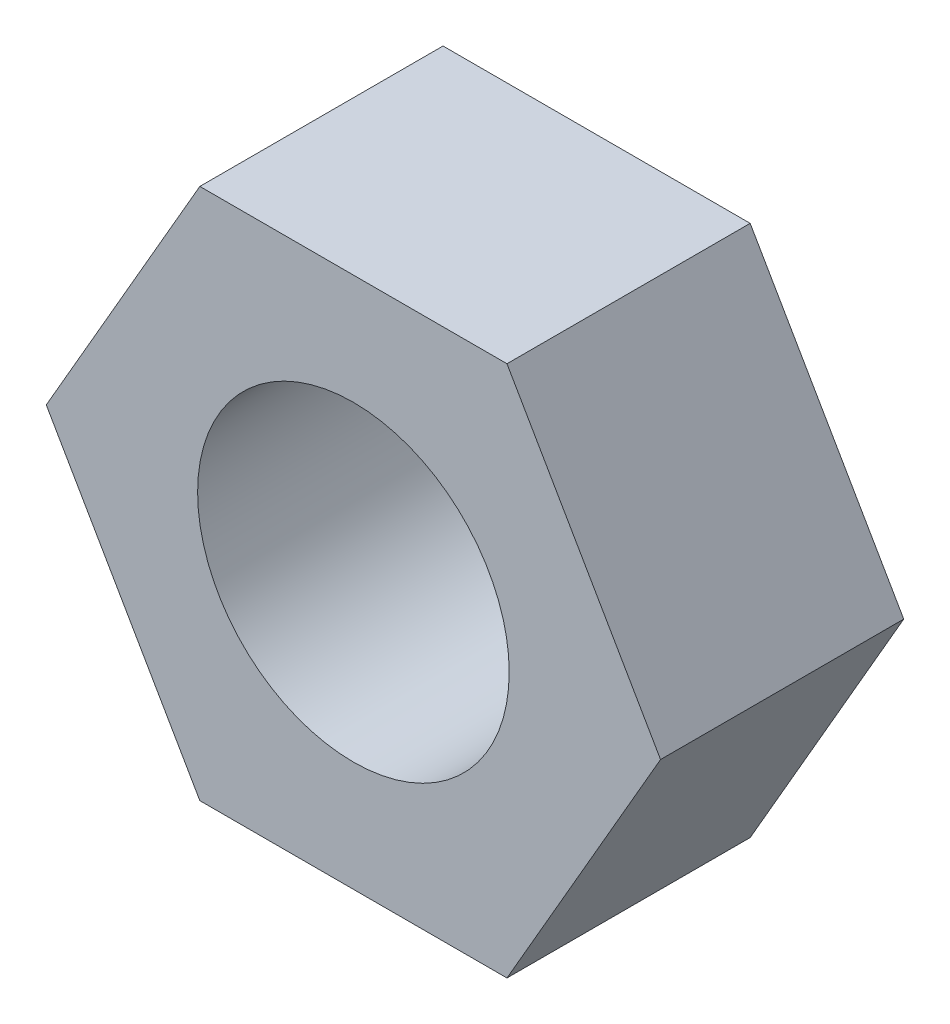
ISO-10303-21;
HEADER;
FILE_DESCRIPTION(('STEP AP214'),'2;1');
FILE_NAME('part.step','',(''),(''),'','','');
FILE_SCHEMA(('AUTOMOTIVE_DESIGN { 1 0 10303 214 1 1 1 1 }'));
ENDSEC;
DATA;
#1=APPLICATION_CONTEXT('core data for automotive mechanical design processes');
#2=APPLICATION_PROTOCOL_DEFINITION('international standard','automotive_design',2000,#1);
#3=PRODUCT_CONTEXT('',#1,'mechanical');
#4=PRODUCT('Part','Part','',(#3));
#5=PRODUCT_RELATED_PRODUCT_CATEGORY('part','',(#4));
#6=PRODUCT_DEFINITION_FORMATION('','',#4);
#7=PRODUCT_DEFINITION_CONTEXT('part definition',#1,'design');
#8=PRODUCT_DEFINITION('design','',#6,#7);
#9=PRODUCT_DEFINITION_SHAPE('','',#8);
#10=(LENGTH_UNIT() NAMED_UNIT(*) SI_UNIT(.MILLI.,.METRE.));
#11=(NAMED_UNIT(*) PLANE_ANGLE_UNIT() SI_UNIT($,.RADIAN.));
#12=(NAMED_UNIT(*) SI_UNIT($,.STERADIAN.) SOLID_ANGLE_UNIT());
#13=UNCERTAINTY_MEASURE_WITH_UNIT(LENGTH_MEASURE(1.E-05),#10,'distance_accuracy_value','');
#14=(GEOMETRIC_REPRESENTATION_CONTEXT(3) GLOBAL_UNCERTAINTY_ASSIGNED_CONTEXT((#13)) GLOBAL_UNIT_ASSIGNED_CONTEXT((#10,
#11,#12)) REPRESENTATION_CONTEXT('',''));
#15=CARTESIAN_POINT('',(0.,0.,0.));
#16=DIRECTION('',(0.,0.,1.));
#17=DIRECTION('',(1.,0.,0.));
#18=AXIS2_PLACEMENT_3D('',#15,#16,#17);
#19=CARTESIAN_POINT('',(2.02072594216373,-3.49999999999998,3.2));
#20=DIRECTION('',(-0.866025403784442,0.499999999999995,0.));
#21=DIRECTION('',(-0.499999999999995,-0.866025403784442,0.));
#22=AXIS2_PLACEMENT_3D('',#19,#20,#21);
#23=PLANE('',#22);
#24=DIRECTION('',(0.499999999999995,0.866025403784442,0.));
#25=VECTOR('',#24,1.);
#26=CARTESIAN_POINT('',(2.02072594216373,-3.49999999999998,0.));
#27=LINE('',#26,#25);
#28=CARTESIAN_POINT('',(2.02072594216373,-3.49999999999998,0.));
#29=VERTEX_POINT('',#28);
#30=CARTESIAN_POINT('',(4.04145188432738,0.,0.));
#31=VERTEX_POINT('',#30);
#32=EDGE_CURVE('E117',#29,#31,#27,.T.);
#33=ORIENTED_EDGE('',*,*,#32,.T.);
#34=DIRECTION('',(0.,0.,-1.));
#35=VECTOR('',#34,1.);
#36=CARTESIAN_POINT('',(4.04145188432738,0.,3.2));
#37=LINE('',#36,#35);
#38=CARTESIAN_POINT('',(4.04145188432738,0.,3.2));
#39=VERTEX_POINT('',#38);
#40=EDGE_CURVE('E11',#39,#31,#37,.T.);
#41=ORIENTED_EDGE('',*,*,#40,.F.);
#42=DIRECTION('',(0.499999999999995,0.866025403784442,0.));
#43=VECTOR('',#42,1.);
#44=CARTESIAN_POINT('',(2.02072594216373,-3.49999999999998,3.2));
#45=LINE('',#44,#43);
#46=CARTESIAN_POINT('',(2.02072594216373,-3.49999999999998,3.2));
#47=VERTEX_POINT('',#46);
#48=EDGE_CURVE('E128',#47,#39,#45,.T.);
#49=ORIENTED_EDGE('',*,*,#48,.F.);
#50=DIRECTION('',(0.,0.,-1.));
#51=VECTOR('',#50,1.);
#52=CARTESIAN_POINT('',(2.02072594216373,-3.49999999999998,3.2));
#53=LINE('',#52,#51);
#54=EDGE_CURVE('E113',#47,#29,#53,.T.);
#55=ORIENTED_EDGE('',*,*,#54,.T.);
#56=EDGE_LOOP('',(#33,#41,#49,#55));
#57=FACE_BOUND('',#56,.T.);
#58=ADVANCED_FACE('F33',(#57),#23,.F.);
#59=CARTESIAN_POINT('',(4.04145188432738,0.,3.2));
#60=DIRECTION('',(-0.866025403784438,-0.500000000000001,0.));
#61=DIRECTION('',(0.500000000000001,-0.866025403784438,0.));
#62=AXIS2_PLACEMENT_3D('',#59,#60,#61);
#63=PLANE('',#62);
#64=DIRECTION('',(-0.500000000000001,0.866025403784438,0.));
#65=VECTOR('',#64,1.);
#66=CARTESIAN_POINT('',(4.04145188432738,0.,0.));
#67=LINE('',#66,#65);
#68=CARTESIAN_POINT('',(2.02072594216368,3.50000000000001,0.));
#69=VERTEX_POINT('',#68);
#70=EDGE_CURVE('E120',#31,#69,#67,.T.);
#71=ORIENTED_EDGE('',*,*,#70,.T.);
#72=DIRECTION('',(0.,0.,-1.));
#73=VECTOR('',#72,1.);
#74=CARTESIAN_POINT('',(2.02072594216368,3.50000000000001,3.2));
#75=LINE('',#74,#73);
#76=CARTESIAN_POINT('',(2.02072594216368,3.50000000000001,3.2));
#77=VERTEX_POINT('',#76);
#78=EDGE_CURVE('E41',#77,#69,#75,.T.);
#79=ORIENTED_EDGE('',*,*,#78,.F.);
#80=DIRECTION('',(-0.500000000000001,0.866025403784438,0.));
#81=VECTOR('',#80,1.);
#82=CARTESIAN_POINT('',(4.04145188432738,0.,3.2));
#83=LINE('',#82,#81);
#84=EDGE_CURVE('E86',#39,#77,#83,.T.);
#85=ORIENTED_EDGE('',*,*,#84,.F.);
#86=ORIENTED_EDGE('',*,*,#40,.T.);
#87=EDGE_LOOP('',(#71,#79,#85,#86));
#88=FACE_BOUND('',#87,.T.);
#89=ADVANCED_FACE('F153',(#88),#63,.F.);
#90=CARTESIAN_POINT('',(2.02072594216368,3.50000000000001,3.2));
#91=DIRECTION('',(0.,-1.,0.));
#92=DIRECTION('',(1.,0.,0.));
#93=AXIS2_PLACEMENT_3D('',#90,#91,#92);
#94=PLANE('',#93);
#95=DIRECTION('',(-1.,0.,0.));
#96=VECTOR('',#95,1.);
#97=CARTESIAN_POINT('',(2.02072594216368,3.50000000000001,0.));
#98=LINE('',#97,#96);
#99=CARTESIAN_POINT('',(-2.02072594216371,3.49999999999999,0.));
#100=VERTEX_POINT('',#99);
#101=EDGE_CURVE('E123',#69,#100,#98,.T.);
#102=ORIENTED_EDGE('',*,*,#101,.T.);
#103=DIRECTION('',(0.,0.,-1.));
#104=VECTOR('',#103,1.);
#105=CARTESIAN_POINT('',(-2.02072594216371,3.49999999999999,3.2));
#106=LINE('',#105,#104);
#107=CARTESIAN_POINT('',(-2.02072594216371,3.49999999999999,3.2));
#108=VERTEX_POINT('',#107);
#109=EDGE_CURVE('E108',#108,#100,#106,.T.);
#110=ORIENTED_EDGE('',*,*,#109,.F.);
#111=DIRECTION('',(-1.,0.,0.));
#112=VECTOR('',#111,1.);
#113=CARTESIAN_POINT('',(2.02072594216368,3.50000000000001,3.2));
#114=LINE('',#113,#112);
#115=EDGE_CURVE('E99',#77,#108,#114,.T.);
#116=ORIENTED_EDGE('',*,*,#115,.F.);
#117=ORIENTED_EDGE('',*,*,#78,.T.);
#118=EDGE_LOOP('',(#102,#110,#116,#117));
#119=FACE_BOUND('',#118,.T.);
#120=ADVANCED_FACE('F134',(#119),#94,.F.);
#121=CARTESIAN_POINT('',(-2.02072594216371,3.49999999999999,3.2));
#122=DIRECTION('',(0.866025403784442,-0.499999999999995,0.));
#123=DIRECTION('',(0.499999999999995,0.866025403784442,0.));
#124=AXIS2_PLACEMENT_3D('',#121,#122,#123);
#125=PLANE('',#124);
#126=DIRECTION('',(-0.499999999999995,-0.866025403784442,0.));
#127=VECTOR('',#126,1.);
#128=CARTESIAN_POINT('',(-2.02072594216371,3.49999999999999,0.));
#129=LINE('',#128,#127);
#130=CARTESIAN_POINT('',(-4.04145188432738,0.,0.));
#131=VERTEX_POINT('',#130);
#132=EDGE_CURVE('E107',#100,#131,#129,.T.);
#133=ORIENTED_EDGE('',*,*,#132,.T.);
#134=DIRECTION('',(0.,0.,-1.));
#135=VECTOR('',#134,1.);
#136=CARTESIAN_POINT('',(-4.04145188432738,0.,3.2));
#137=LINE('',#136,#135);
#138=CARTESIAN_POINT('',(-4.04145188432738,0.,3.2));
#139=VERTEX_POINT('',#138);
#140=EDGE_CURVE('E104',#139,#131,#137,.T.);
#141=ORIENTED_EDGE('',*,*,#140,.F.);
#142=DIRECTION('',(-0.499999999999995,-0.866025403784442,0.));
#143=VECTOR('',#142,1.);
#144=CARTESIAN_POINT('',(-2.02072594216371,3.49999999999999,3.2));
#145=LINE('',#144,#143);
#146=EDGE_CURVE('E93',#108,#139,#145,.T.);
#147=ORIENTED_EDGE('',*,*,#146,.F.);
#148=ORIENTED_EDGE('',*,*,#109,.T.);
#149=EDGE_LOOP('',(#133,#141,#147,#148));
#150=FACE_BOUND('',#149,.T.);
#151=ADVANCED_FACE('F105',(#150),#125,.F.);
#152=CARTESIAN_POINT('',(-4.04145188432738,0.,3.2));
#153=DIRECTION('',(0.866025403784435,0.500000000000007,0.));
#154=DIRECTION('',(-0.500000000000007,0.866025403784435,0.));
#155=AXIS2_PLACEMENT_3D('',#152,#153,#154);
#156=PLANE('',#155);
#157=DIRECTION('',(0.500000000000007,-0.866025403784435,0.));
#158=VECTOR('',#157,1.);
#159=CARTESIAN_POINT('',(-4.04145188432738,0.,0.));
#160=LINE('',#159,#158);
#161=CARTESIAN_POINT('',(-2.02072594216366,-3.50000000000002,0.));
#162=VERTEX_POINT('',#161);
#163=EDGE_CURVE('E72',#131,#162,#160,.T.);
#164=ORIENTED_EDGE('',*,*,#163,.T.);
#165=DIRECTION('',(0.,0.,-1.));
#166=VECTOR('',#165,1.);
#167=CARTESIAN_POINT('',(-2.02072594216366,-3.50000000000002,3.2));
#168=LINE('',#167,#166);
#169=CARTESIAN_POINT('',(-2.02072594216366,-3.50000000000002,3.2));
#170=VERTEX_POINT('',#169);
#171=EDGE_CURVE('E109',#170,#162,#168,.T.);
#172=ORIENTED_EDGE('',*,*,#171,.F.);
#173=DIRECTION('',(0.500000000000007,-0.866025403784435,0.));
#174=VECTOR('',#173,1.);
#175=CARTESIAN_POINT('',(-4.04145188432738,0.,3.2));
#176=LINE('',#175,#174);
#177=EDGE_CURVE('E97',#139,#170,#176,.T.);
#178=ORIENTED_EDGE('',*,*,#177,.F.);
#179=ORIENTED_EDGE('',*,*,#140,.T.);
#180=EDGE_LOOP('',(#164,#172,#178,#179));
#181=FACE_BOUND('',#180,.T.);
#182=ADVANCED_FACE('F111',(#181),#156,.F.);
#183=CARTESIAN_POINT('',(-2.02072594216366,-3.50000000000002,3.2));
#184=DIRECTION('',(0.,1.,0.));
#185=DIRECTION('',(-1.,0.,0.));
#186=AXIS2_PLACEMENT_3D('',#183,#184,#185);
#187=PLANE('',#186);
#188=DIRECTION('',(1.,0.,0.));
#189=VECTOR('',#188,1.);
#190=CARTESIAN_POINT('',(-2.02072594216366,-3.50000000000002,0.));
#191=LINE('',#190,#189);
#192=EDGE_CURVE('E78',#162,#29,#191,.T.);
#193=ORIENTED_EDGE('',*,*,#192,.T.);
#194=ORIENTED_EDGE('',*,*,#54,.F.);
#195=DIRECTION('',(1.,0.,0.));
#196=VECTOR('',#195,1.);
#197=CARTESIAN_POINT('',(-2.02072594216366,-3.50000000000002,3.2));
#198=LINE('',#197,#196);
#199=EDGE_CURVE('E49',#170,#47,#198,.T.);
#200=ORIENTED_EDGE('',*,*,#199,.F.);
#201=ORIENTED_EDGE('',*,*,#171,.T.);
#202=EDGE_LOOP('',(#193,#194,#200,#201));
#203=FACE_BOUND('',#202,.T.);
#204=ADVANCED_FACE('F141',(#203),#187,.F.);
#205=CARTESIAN_POINT('',(0.,0.,3.2));
#206=DIRECTION('',(0.,0.,1.));
#207=DIRECTION('',(1.,0.,0.));
#208=AXIS2_PLACEMENT_3D('',#205,#206,#207);
#209=PLANE('',#208);
#210=CARTESIAN_POINT('',(0.,0.,3.2));
#211=DIRECTION('',(0.,0.,1.));
#212=DIRECTION('',(1.,0.,0.));
#213=AXIS2_PLACEMENT_3D('',#210,#211,#212);
#214=CIRCLE('',#213,2.05);
#215=CARTESIAN_POINT('',(2.05,0.,3.2));
#216=VERTEX_POINT('',#215);
#217=EDGE_CURVE('E208',#216,#216,#214,.T.);
#218=ORIENTED_EDGE('',*,*,#217,.F.);
#219=EDGE_LOOP('',(#218));
#220=FACE_BOUND('',#219,.T.);
#221=ORIENTED_EDGE('',*,*,#48,.T.);
#222=ORIENTED_EDGE('',*,*,#84,.T.);
#223=ORIENTED_EDGE('',*,*,#115,.T.);
#224=ORIENTED_EDGE('',*,*,#146,.T.);
#225=ORIENTED_EDGE('',*,*,#177,.T.);
#226=ORIENTED_EDGE('',*,*,#199,.T.);
#227=EDGE_LOOP('',(#221,#222,#223,#224,#225,#226));
#228=FACE_BOUND('',#227,.T.);
#229=ADVANCED_FACE('F95',(#220,#228),#209,.T.);
#230=CARTESIAN_POINT('',(0.,0.,0.));
#231=DIRECTION('',(0.,0.,1.));
#232=DIRECTION('',(1.,0.,0.));
#233=AXIS2_PLACEMENT_3D('',#230,#231,#232);
#234=PLANE('',#233);
#235=CARTESIAN_POINT('',(0.,0.,0.));
#236=DIRECTION('',(0.,0.,1.));
#237=DIRECTION('',(1.,0.,0.));
#238=AXIS2_PLACEMENT_3D('',#235,#236,#237);
#239=CIRCLE('',#238,2.05);
#240=CARTESIAN_POINT('',(2.05,0.,0.));
#241=VERTEX_POINT('',#240);
#242=EDGE_CURVE('E121',#241,#241,#239,.T.);
#243=ORIENTED_EDGE('',*,*,#242,.T.);
#244=EDGE_LOOP('',(#243));
#245=FACE_BOUND('',#244,.T.);
#246=ORIENTED_EDGE('',*,*,#32,.F.);
#247=ORIENTED_EDGE('',*,*,#192,.F.);
#248=ORIENTED_EDGE('',*,*,#163,.F.);
#249=ORIENTED_EDGE('',*,*,#132,.F.);
#250=ORIENTED_EDGE('',*,*,#101,.F.);
#251=ORIENTED_EDGE('',*,*,#70,.F.);
#252=EDGE_LOOP('',(#246,#247,#248,#249,#250,#251));
#253=FACE_BOUND('',#252,.T.);
#254=ADVANCED_FACE('F137',(#245,#253),#234,.F.);
#255=CARTESIAN_POINT('',(0.,0.,0.));
#256=DIRECTION('',(0.,0.,1.));
#257=DIRECTION('',(1.,0.,0.));
#258=AXIS2_PLACEMENT_3D('',#255,#256,#257);
#259=CYLINDRICAL_SURFACE('',#258,2.05);
#260=ORIENTED_EDGE('',*,*,#242,.F.);
#261=EDGE_LOOP('',(#260));
#262=FACE_BOUND('',#261,.T.);
#263=ORIENTED_EDGE('',*,*,#217,.T.);
#264=EDGE_LOOP('',(#263));
#265=FACE_BOUND('',#264,.T.);
#266=ADVANCED_FACE('F190',(#262,#265),#259,.F.);
#267=CLOSED_SHELL('',(#58,#89,#120,#151,#182,#204,#229,#254,#266));
#268=MANIFOLD_SOLID_BREP('B2',#267);
#269=ADVANCED_BREP_SHAPE_REPRESENTATION('',(#18,#268),#14);
#270=SHAPE_DEFINITION_REPRESENTATION(#9,#269);
ENDSEC;
END-ISO-10303-21;
